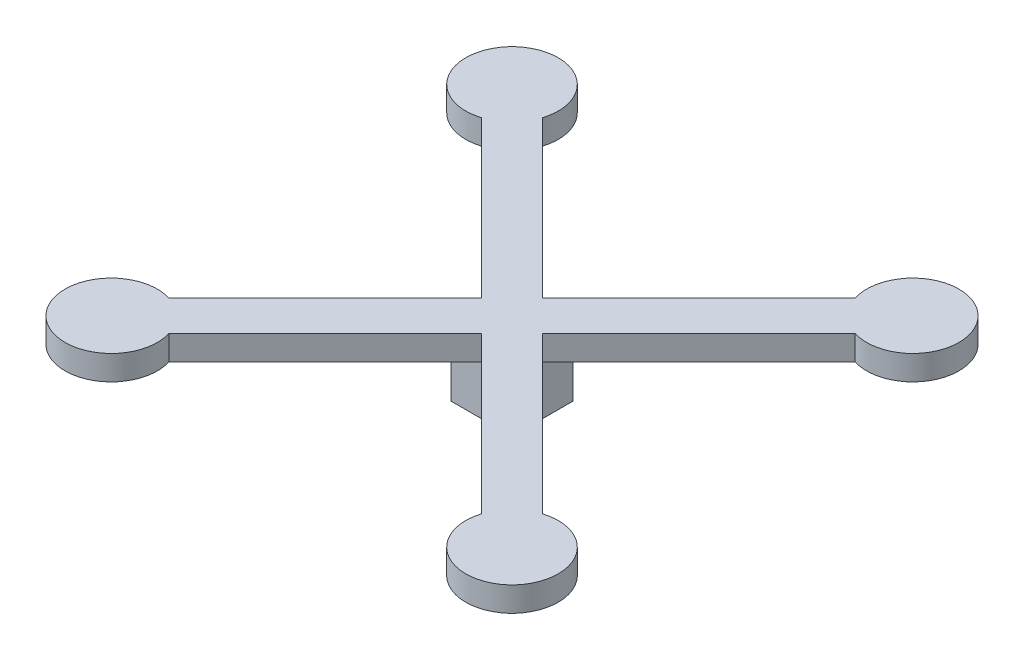
ISO-10303-21;
HEADER;
FILE_DESCRIPTION(('STEP AP214'),'2;1');
FILE_NAME('part.step','',(''),(''),'','','');
FILE_SCHEMA(('AUTOMOTIVE_DESIGN { 1 0 10303 214 1 1 1 1 }'));
ENDSEC;
DATA;
#1=APPLICATION_CONTEXT('core data for automotive mechanical design processes');
#2=APPLICATION_PROTOCOL_DEFINITION('international standard','automotive_design',2000,#1);
#3=PRODUCT_CONTEXT('',#1,'mechanical');
#4=PRODUCT('Part','Part','',(#3));
#5=PRODUCT_RELATED_PRODUCT_CATEGORY('part','',(#4));
#6=PRODUCT_DEFINITION_FORMATION('','',#4);
#7=PRODUCT_DEFINITION_CONTEXT('part definition',#1,'design');
#8=PRODUCT_DEFINITION('design','',#6,#7);
#9=PRODUCT_DEFINITION_SHAPE('','',#8);
#10=(LENGTH_UNIT() NAMED_UNIT(*) SI_UNIT(.MILLI.,.METRE.));
#11=(NAMED_UNIT(*) PLANE_ANGLE_UNIT() SI_UNIT($,.RADIAN.));
#12=(NAMED_UNIT(*) SI_UNIT($,.STERADIAN.) SOLID_ANGLE_UNIT());
#13=UNCERTAINTY_MEASURE_WITH_UNIT(LENGTH_MEASURE(1.E-05),#10,'distance_accuracy_value','');
#14=(GEOMETRIC_REPRESENTATION_CONTEXT(3) GLOBAL_UNCERTAINTY_ASSIGNED_CONTEXT((#13)) GLOBAL_UNIT_ASSIGNED_CONTEXT((#10,
#11,#12)) REPRESENTATION_CONTEXT('',''));
#15=CARTESIAN_POINT('',(0.,0.,0.));
#16=DIRECTION('',(0.,0.,1.));
#17=DIRECTION('',(1.,0.,0.));
#18=AXIS2_PLACEMENT_3D('',#15,#16,#17);
#19=CARTESIAN_POINT('',(0.,0.,0.));
#20=DIRECTION('',(0.,1.,0.));
#21=DIRECTION('',(0.,0.,1.));
#22=AXIS2_PLACEMENT_3D('',#19,#20,#21);
#23=PLANE('',#22);
#24=DIRECTION('',(1.,0.,0.));
#25=VECTOR('',#24,1.);
#26=CARTESIAN_POINT('',(-24.7487373415287,0.,-24.7487373415286));
#27=LINE('',#26,#25);
#28=CARTESIAN_POINT('',(-24.7487373415287,0.,-24.7487373415286));
#29=VERTEX_POINT('',#28);
#30=CARTESIAN_POINT('',(3.72098185597025E-13,0.,-24.7487373415296));
#31=VERTEX_POINT('',#30);
#32=EDGE_CURVE('E51',#29,#31,#27,.T.);
#33=ORIENTED_EDGE('',*,*,#32,.F.);
#34=DIRECTION('',(0.,0.,-1.));
#35=VECTOR('',#34,1.);
#36=CARTESIAN_POINT('',(-24.7487373415287,0.,24.7487373415286));
#37=LINE('',#36,#35);
#38=CARTESIAN_POINT('',(-24.7487373415287,0.,-3.55618312575245E-13));
#39=VERTEX_POINT('',#38);
#40=EDGE_CURVE('E49',#39,#29,#37,.T.);
#41=ORIENTED_EDGE('',*,*,#40,.F.);
#42=DIRECTION('',(0.707106781186552,0.,0.707106781186543));
#43=VECTOR('',#42,1.);
#44=CARTESIAN_POINT('',(-12.374368670764,0.,12.3743686707641));
#45=LINE('',#44,#43);
#46=CARTESIAN_POINT('',(-151.556849544553,0.,-126.808112203023));
#47=VERTEX_POINT('',#46);
#48=EDGE_CURVE('E223',#47,#39,#45,.T.);
#49=ORIENTED_EDGE('',*,*,#48,.F.);
#50=CARTESIAN_POINT('',(-162.634559672906,0.,-162.634559672905));
#51=DIRECTION('',(0.,1.,0.));
#52=DIRECTION('',(0.,0.,1.));
#53=AXIS2_PLACEMENT_3D('',#50,#51,#52);
#54=CIRCLE('',#53,37.5);
#55=CARTESIAN_POINT('',(-126.808112203024,0.,-151.556849544552));
#56=VERTEX_POINT('',#55);
#57=EDGE_CURVE('E221',#56,#47,#54,.T.);
#58=ORIENTED_EDGE('',*,*,#57,.F.);
#59=DIRECTION('',(-0.707106781186552,0.,-0.707106781186543));
#60=VECTOR('',#59,1.);
#61=CARTESIAN_POINT('',(12.374368670765,0.,-12.3743686707651));
#62=LINE('',#61,#60);
#63=EDGE_CURVE('E219',#31,#56,#62,.T.);
#64=ORIENTED_EDGE('',*,*,#63,.F.);
#65=EDGE_LOOP('',(#33,#41,#49,#58,#64));
#66=FACE_BOUND('',#65,.T.);
#67=ADVANCED_FACE('F40',(#66),#23,.F.);
#68=CARTESIAN_POINT('',(24.7487373415287,0.,-24.7487373415286));
#69=VERTEX_POINT('',#68);
#70=EDGE_CURVE('E11',#31,#69,#27,.T.);
#71=ORIENTED_EDGE('',*,*,#70,.F.);
#72=DIRECTION('',(-0.707106781186543,0.,0.707106781186552));
#73=VECTOR('',#72,1.);
#74=CARTESIAN_POINT('',(-12.3743686707646,0.,-12.3743686707645));
#75=LINE('',#74,#73);
#76=CARTESIAN_POINT('',(126.808112203023,0.,-151.556849544554));
#77=VERTEX_POINT('',#76);
#78=EDGE_CURVE('E184',#77,#31,#75,.T.);
#79=ORIENTED_EDGE('',*,*,#78,.F.);
#80=CARTESIAN_POINT('',(162.634559672905,0.,-162.634559672907));
#81=DIRECTION('',(0.,1.,0.));
#82=DIRECTION('',(0.,0.,1.));
#83=AXIS2_PLACEMENT_3D('',#80,#81,#82);
#84=CIRCLE('',#83,37.5);
#85=CARTESIAN_POINT('',(151.556849544552,0.,-126.808112203025));
#86=VERTEX_POINT('',#85);
#87=EDGE_CURVE('E181',#86,#77,#84,.T.);
#88=ORIENTED_EDGE('',*,*,#87,.F.);
#89=DIRECTION('',(0.707106781186544,0.,-0.707106781186551));
#90=VECTOR('',#89,1.);
#91=CARTESIAN_POINT('',(12.3743686707646,0.,12.3743686707645));
#92=LINE('',#91,#90);
#93=CARTESIAN_POINT('',(24.7487373415296,0.,-6.21898366137685E-13));
#94=VERTEX_POINT('',#93);
#95=EDGE_CURVE('E194',#94,#86,#92,.T.);
#96=ORIENTED_EDGE('',*,*,#95,.F.);
#97=DIRECTION('',(0.,0.,1.));
#98=VECTOR('',#97,1.);
#99=CARTESIAN_POINT('',(24.7487373415287,0.,24.7487373415286));
#100=LINE('',#99,#98);
#101=EDGE_CURVE('E65',#69,#94,#100,.T.);
#102=ORIENTED_EDGE('',*,*,#101,.F.);
#103=EDGE_LOOP('',(#71,#79,#88,#96,#102));
#104=FACE_BOUND('',#103,.T.);
#105=ADVANCED_FACE('F294',(#104),#23,.F.);
#106=CARTESIAN_POINT('',(24.7487373415287,0.,24.7487373415286));
#107=VERTEX_POINT('',#106);
#108=EDGE_CURVE('E180',#94,#107,#100,.T.);
#109=ORIENTED_EDGE('',*,*,#108,.F.);
#110=DIRECTION('',(-0.707106781186552,0.,-0.707106781186543));
#111=VECTOR('',#110,1.);
#112=CARTESIAN_POINT('',(12.374368670765,0.,-12.3743686707651));
#113=LINE('',#112,#111);
#114=CARTESIAN_POINT('',(151.556849544554,0.,126.808112203022));
#115=VERTEX_POINT('',#114);
#116=EDGE_CURVE('E237',#115,#94,#113,.T.);
#117=ORIENTED_EDGE('',*,*,#116,.F.);
#118=CARTESIAN_POINT('',(162.634559672907,0.,162.634559672904));
#119=DIRECTION('',(0.,1.,0.));
#120=DIRECTION('',(0.,0.,1.));
#121=AXIS2_PLACEMENT_3D('',#118,#119,#120);
#122=CIRCLE('',#121,37.5);
#123=CARTESIAN_POINT('',(126.808112203025,0.,151.556849544551));
#124=VERTEX_POINT('',#123);
#125=EDGE_CURVE('E235',#124,#115,#122,.T.);
#126=ORIENTED_EDGE('',*,*,#125,.F.);
#127=DIRECTION('',(0.707106781186552,0.,0.707106781186543));
#128=VECTOR('',#127,1.);
#129=CARTESIAN_POINT('',(-12.374368670764,0.,12.3743686707642));
#130=LINE('',#129,#128);
#131=CARTESIAN_POINT('',(6.13224748757801E-13,0.,24.7487373415286));
#132=VERTEX_POINT('',#131);
#133=EDGE_CURVE('E233',#132,#124,#130,.T.);
#134=ORIENTED_EDGE('',*,*,#133,.F.);
#135=DIRECTION('',(-1.,0.,0.));
#136=VECTOR('',#135,1.);
#137=CARTESIAN_POINT('',(-24.7487373415287,0.,24.7487373415286));
#138=LINE('',#137,#136);
#139=EDGE_CURVE('E279',#107,#132,#138,.T.);
#140=ORIENTED_EDGE('',*,*,#139,.F.);
#141=EDGE_LOOP('',(#109,#117,#126,#134,#140));
#142=FACE_BOUND('',#141,.T.);
#143=ADVANCED_FACE('F317',(#142),#23,.F.);
#144=CARTESIAN_POINT('',(-24.7487373415287,0.,24.7487373415286));
#145=VERTEX_POINT('',#144);
#146=EDGE_CURVE('E282',#145,#39,#37,.T.);
#147=ORIENTED_EDGE('',*,*,#146,.F.);
#148=EDGE_CURVE('E275',#132,#145,#138,.T.);
#149=ORIENTED_EDGE('',*,*,#148,.F.);
#150=DIRECTION('',(0.707106781186543,0.,-0.707106781186552));
#151=VECTOR('',#150,1.);
#152=CARTESIAN_POINT('',(12.3743686707646,0.,12.3743686707645));
#153=LINE('',#152,#151);
#154=CARTESIAN_POINT('',(-126.808112203022,0.,151.556849544553));
#155=VERTEX_POINT('',#154);
#156=EDGE_CURVE('E230',#155,#132,#153,.T.);
#157=ORIENTED_EDGE('',*,*,#156,.F.);
#158=CARTESIAN_POINT('',(-162.634559672904,0.,162.634559672906));
#159=DIRECTION('',(0.,1.,0.));
#160=DIRECTION('',(0.,0.,1.));
#161=AXIS2_PLACEMENT_3D('',#158,#159,#160);
#162=CIRCLE('',#161,37.5);
#163=CARTESIAN_POINT('',(-151.556849544551,0.,126.808112203024));
#164=VERTEX_POINT('',#163);
#165=EDGE_CURVE('E228',#164,#155,#162,.T.);
#166=ORIENTED_EDGE('',*,*,#165,.F.);
#167=DIRECTION('',(-0.707106781186543,0.,0.707106781186552));
#168=VECTOR('',#167,1.);
#169=CARTESIAN_POINT('',(-12.3743686707647,0.,-12.3743686707645));
#170=LINE('',#169,#168);
#171=EDGE_CURVE('E226',#39,#164,#170,.T.);
#172=ORIENTED_EDGE('',*,*,#171,.F.);
#173=EDGE_LOOP('',(#147,#149,#157,#166,#172));
#174=FACE_BOUND('',#173,.T.);
#175=ADVANCED_FACE('F335',(#174),#23,.F.);
#176=CARTESIAN_POINT('',(162.634559672905,20.,-162.634559672907));
#177=DIRECTION('',(0.,-1.,0.));
#178=DIRECTION('',(0.,0.,-1.));
#179=AXIS2_PLACEMENT_3D('',#176,#177,#178);
#180=CYLINDRICAL_SURFACE('',#179,37.5);
#181=ORIENTED_EDGE('',*,*,#87,.T.);
#182=DIRECTION('',(0.,-1.,0.));
#183=VECTOR('',#182,1.);
#184=CARTESIAN_POINT('',(126.808112203023,20.,-151.556849544554));
#185=LINE('',#184,#183);
#186=CARTESIAN_POINT('',(126.808112203023,20.,-151.556849544554));
#187=VERTEX_POINT('',#186);
#188=EDGE_CURVE('E44',#187,#77,#185,.T.);
#189=ORIENTED_EDGE('',*,*,#188,.F.);
#190=CARTESIAN_POINT('',(162.634559672905,20.,-162.634559672907));
#191=DIRECTION('',(0.,1.,0.));
#192=DIRECTION('',(0.,0.,1.));
#193=AXIS2_PLACEMENT_3D('',#190,#191,#192);
#194=CIRCLE('',#193,37.5);
#195=CARTESIAN_POINT('',(151.556849544552,20.,-126.808112203025));
#196=VERTEX_POINT('',#195);
#197=EDGE_CURVE('E190',#196,#187,#194,.T.);
#198=ORIENTED_EDGE('',*,*,#197,.F.);
#199=DIRECTION('',(0.,-1.,0.));
#200=VECTOR('',#199,1.);
#201=CARTESIAN_POINT('',(151.556849544552,20.,-126.808112203025));
#202=LINE('',#201,#200);
#203=EDGE_CURVE('E215',#196,#86,#202,.T.);
#204=ORIENTED_EDGE('',*,*,#203,.T.);
#205=EDGE_LOOP('',(#181,#189,#198,#204));
#206=FACE_BOUND('',#205,.T.);
#207=ADVANCED_FACE('F42',(#206),#180,.T.);
#208=CARTESIAN_POINT('',(-12.3743686707646,20.,-12.3743686707645));
#209=DIRECTION('',(0.707106781186552,0.,0.707106781186543));
#210=DIRECTION('',(0.707106781186543,0.,-0.707106781186552));
#211=AXIS2_PLACEMENT_3D('',#208,#209,#210);
#212=PLANE('',#211);
#213=ORIENTED_EDGE('',*,*,#78,.T.);
#214=DIRECTION('',(0.,-1.,0.));
#215=VECTOR('',#214,1.);
#216=CARTESIAN_POINT('',(3.72098185597025E-13,20.,-24.7487373415296));
#217=LINE('',#216,#215);
#218=CARTESIAN_POINT('',(3.72098185597025E-13,20.,-24.7487373415296));
#219=VERTEX_POINT('',#218);
#220=EDGE_CURVE('E269',#219,#31,#217,.T.);
#221=ORIENTED_EDGE('',*,*,#220,.F.);
#222=DIRECTION('',(-0.707106781186543,0.,0.707106781186552));
#223=VECTOR('',#222,1.);
#224=CARTESIAN_POINT('',(-12.3743686707646,20.,-12.3743686707645));
#225=LINE('',#224,#223);
#226=EDGE_CURVE('E193',#187,#219,#225,.T.);
#227=ORIENTED_EDGE('',*,*,#226,.F.);
#228=ORIENTED_EDGE('',*,*,#188,.T.);
#229=EDGE_LOOP('',(#213,#221,#227,#228));
#230=FACE_BOUND('',#229,.T.);
#231=ADVANCED_FACE('F296',(#230),#212,.F.);
#232=CARTESIAN_POINT('',(12.374368670765,20.,-12.3743686707651));
#233=DIRECTION('',(-0.707106781186543,0.,0.707106781186552));
#234=DIRECTION('',(0.707106781186552,0.,0.707106781186543));
#235=AXIS2_PLACEMENT_3D('',#232,#233,#234);
#236=PLANE('',#235);
#237=ORIENTED_EDGE('',*,*,#63,.T.);
#238=DIRECTION('',(0.,-1.,0.));
#239=VECTOR('',#238,1.);
#240=CARTESIAN_POINT('',(-126.808112203024,20.,-151.556849544552));
#241=LINE('',#240,#239);
#242=CARTESIAN_POINT('',(-126.808112203024,20.,-151.556849544552));
#243=VERTEX_POINT('',#242);
#244=EDGE_CURVE('E267',#243,#56,#241,.T.);
#245=ORIENTED_EDGE('',*,*,#244,.F.);
#246=DIRECTION('',(-0.707106781186552,0.,-0.707106781186543));
#247=VECTOR('',#246,1.);
#248=CARTESIAN_POINT('',(12.374368670765,20.,-12.3743686707651));
#249=LINE('',#248,#247);
#250=EDGE_CURVE('E196',#219,#243,#249,.T.);
#251=ORIENTED_EDGE('',*,*,#250,.F.);
#252=ORIENTED_EDGE('',*,*,#220,.T.);
#253=EDGE_LOOP('',(#237,#245,#251,#252));
#254=FACE_BOUND('',#253,.T.);
#255=ADVANCED_FACE('F298',(#254),#236,.F.);
#256=CARTESIAN_POINT('',(-162.634559672906,20.,-162.634559672905));
#257=DIRECTION('',(0.,-1.,0.));
#258=DIRECTION('',(0.,0.,-1.));
#259=AXIS2_PLACEMENT_3D('',#256,#257,#258);
#260=CYLINDRICAL_SURFACE('',#259,37.5);
#261=ORIENTED_EDGE('',*,*,#57,.T.);
#262=DIRECTION('',(0.,-1.,0.));
#263=VECTOR('',#262,1.);
#264=CARTESIAN_POINT('',(-151.556849544553,20.,-126.808112203023));
#265=LINE('',#264,#263);
#266=CARTESIAN_POINT('',(-151.556849544553,20.,-126.808112203023));
#267=VERTEX_POINT('',#266);
#268=EDGE_CURVE('E264',#267,#47,#265,.T.);
#269=ORIENTED_EDGE('',*,*,#268,.F.);
#270=CARTESIAN_POINT('',(-162.634559672906,20.,-162.634559672905));
#271=DIRECTION('',(0.,1.,0.));
#272=DIRECTION('',(0.,0.,1.));
#273=AXIS2_PLACEMENT_3D('',#270,#271,#272);
#274=CIRCLE('',#273,37.5);
#275=EDGE_CURVE('E198',#243,#267,#274,.T.);
#276=ORIENTED_EDGE('',*,*,#275,.F.);
#277=ORIENTED_EDGE('',*,*,#244,.T.);
#278=EDGE_LOOP('',(#261,#269,#276,#277));
#279=FACE_BOUND('',#278,.T.);
#280=ADVANCED_FACE('F413',(#279),#260,.T.);
#281=CARTESIAN_POINT('',(-12.374368670764,20.,12.3743686707641));
#282=DIRECTION('',(0.707106781186543,0.,-0.707106781186552));
#283=DIRECTION('',(-0.707106781186552,0.,-0.707106781186543));
#284=AXIS2_PLACEMENT_3D('',#281,#282,#283);
#285=PLANE('',#284);
#286=ORIENTED_EDGE('',*,*,#48,.T.);
#287=DIRECTION('',(0.,-1.,0.));
#288=VECTOR('',#287,1.);
#289=CARTESIAN_POINT('',(-24.7487373415287,20.,-3.55618312575245E-13));
#290=LINE('',#289,#288);
#291=CARTESIAN_POINT('',(-24.7487373415287,20.,-3.55618312575245E-13));
#292=VERTEX_POINT('',#291);
#293=EDGE_CURVE('E261',#292,#39,#290,.T.);
#294=ORIENTED_EDGE('',*,*,#293,.F.);
#295=DIRECTION('',(0.707106781186552,0.,0.707106781186543));
#296=VECTOR('',#295,1.);
#297=CARTESIAN_POINT('',(-12.374368670764,20.,12.3743686707641));
#298=LINE('',#297,#296);
#299=EDGE_CURVE('E200',#267,#292,#298,.T.);
#300=ORIENTED_EDGE('',*,*,#299,.F.);
#301=ORIENTED_EDGE('',*,*,#268,.T.);
#302=EDGE_LOOP('',(#286,#294,#300,#301));
#303=FACE_BOUND('',#302,.T.);
#304=ADVANCED_FACE('F351',(#303),#285,.F.);
#305=CARTESIAN_POINT('',(-12.3743686707647,20.,-12.3743686707645));
#306=DIRECTION('',(0.707106781186552,0.,0.707106781186543));
#307=DIRECTION('',(0.707106781186543,0.,-0.707106781186552));
#308=AXIS2_PLACEMENT_3D('',#305,#306,#307);
#309=PLANE('',#308);
#310=ORIENTED_EDGE('',*,*,#171,.T.);
#311=DIRECTION('',(0.,-1.,0.));
#312=VECTOR('',#311,1.);
#313=CARTESIAN_POINT('',(-151.556849544551,20.,126.808112203024));
#314=LINE('',#313,#312);
#315=CARTESIAN_POINT('',(-151.556849544551,20.,126.808112203024));
#316=VERTEX_POINT('',#315);
#317=EDGE_CURVE('E258',#316,#164,#314,.T.);
#318=ORIENTED_EDGE('',*,*,#317,.F.);
#319=DIRECTION('',(-0.707106781186543,0.,0.707106781186552));
#320=VECTOR('',#319,1.);
#321=CARTESIAN_POINT('',(-12.3743686707647,20.,-12.3743686707645));
#322=LINE('',#321,#320);
#323=EDGE_CURVE('E202',#292,#316,#322,.T.);
#324=ORIENTED_EDGE('',*,*,#323,.F.);
#325=ORIENTED_EDGE('',*,*,#293,.T.);
#326=EDGE_LOOP('',(#310,#318,#324,#325));
#327=FACE_BOUND('',#326,.T.);
#328=ADVANCED_FACE('F339',(#327),#309,.F.);
#329=CARTESIAN_POINT('',(-162.634559672904,20.,162.634559672906));
#330=DIRECTION('',(0.,-1.,0.));
#331=DIRECTION('',(0.,0.,-1.));
#332=AXIS2_PLACEMENT_3D('',#329,#330,#331);
#333=CYLINDRICAL_SURFACE('',#332,37.5);
#334=ORIENTED_EDGE('',*,*,#165,.T.);
#335=DIRECTION('',(0.,-1.,0.));
#336=VECTOR('',#335,1.);
#337=CARTESIAN_POINT('',(-126.808112203022,20.,151.556849544553));
#338=LINE('',#337,#336);
#339=CARTESIAN_POINT('',(-126.808112203022,20.,151.556849544553));
#340=VERTEX_POINT('',#339);
#341=EDGE_CURVE('E255',#340,#155,#338,.T.);
#342=ORIENTED_EDGE('',*,*,#341,.F.);
#343=CARTESIAN_POINT('',(-162.634559672904,20.,162.634559672906));
#344=DIRECTION('',(0.,1.,0.));
#345=DIRECTION('',(0.,0.,1.));
#346=AXIS2_PLACEMENT_3D('',#343,#344,#345);
#347=CIRCLE('',#346,37.5);
#348=EDGE_CURVE('E204',#316,#340,#347,.T.);
#349=ORIENTED_EDGE('',*,*,#348,.F.);
#350=ORIENTED_EDGE('',*,*,#317,.T.);
#351=EDGE_LOOP('',(#334,#342,#349,#350));
#352=FACE_BOUND('',#351,.T.);
#353=ADVANCED_FACE('F343',(#352),#333,.T.);
#354=CARTESIAN_POINT('',(12.3743686707646,20.,12.3743686707645));
#355=DIRECTION('',(-0.707106781186552,0.,-0.707106781186543));
#356=DIRECTION('',(-0.707106781186543,0.,0.707106781186552));
#357=AXIS2_PLACEMENT_3D('',#354,#355,#356);
#358=PLANE('',#357);
#359=ORIENTED_EDGE('',*,*,#156,.T.);
#360=DIRECTION('',(0.,-1.,0.));
#361=VECTOR('',#360,1.);
#362=CARTESIAN_POINT('',(6.13224748757801E-13,20.,24.7487373415286));
#363=LINE('',#362,#361);
#364=CARTESIAN_POINT('',(6.13224748757801E-13,20.,24.7487373415286));
#365=VERTEX_POINT('',#364);
#366=EDGE_CURVE('E252',#365,#132,#363,.T.);
#367=ORIENTED_EDGE('',*,*,#366,.F.);
#368=DIRECTION('',(0.707106781186543,0.,-0.707106781186552));
#369=VECTOR('',#368,1.);
#370=CARTESIAN_POINT('',(12.3743686707646,20.,12.3743686707645));
#371=LINE('',#370,#369);
#372=EDGE_CURVE('E206',#340,#365,#371,.T.);
#373=ORIENTED_EDGE('',*,*,#372,.F.);
#374=ORIENTED_EDGE('',*,*,#341,.T.);
#375=EDGE_LOOP('',(#359,#367,#373,#374));
#376=FACE_BOUND('',#375,.T.);
#377=ADVANCED_FACE('F331',(#376),#358,.F.);
#378=CARTESIAN_POINT('',(-12.374368670764,20.,12.3743686707642));
#379=DIRECTION('',(0.707106781186543,0.,-0.707106781186552));
#380=DIRECTION('',(-0.707106781186552,0.,-0.707106781186543));
#381=AXIS2_PLACEMENT_3D('',#378,#379,#380);
#382=PLANE('',#381);
#383=ORIENTED_EDGE('',*,*,#133,.T.);
#384=DIRECTION('',(0.,-1.,0.));
#385=VECTOR('',#384,1.);
#386=CARTESIAN_POINT('',(126.808112203025,20.,151.556849544551));
#387=LINE('',#386,#385);
#388=CARTESIAN_POINT('',(126.808112203025,20.,151.556849544551));
#389=VERTEX_POINT('',#388);
#390=EDGE_CURVE('E249',#389,#124,#387,.T.);
#391=ORIENTED_EDGE('',*,*,#390,.F.);
#392=DIRECTION('',(0.707106781186552,0.,0.707106781186543));
#393=VECTOR('',#392,1.);
#394=CARTESIAN_POINT('',(-12.374368670764,20.,12.3743686707642));
#395=LINE('',#394,#393);
#396=EDGE_CURVE('E208',#365,#389,#395,.T.);
#397=ORIENTED_EDGE('',*,*,#396,.F.);
#398=ORIENTED_EDGE('',*,*,#366,.T.);
#399=EDGE_LOOP('',(#383,#391,#397,#398));
#400=FACE_BOUND('',#399,.T.);
#401=ADVANCED_FACE('F321',(#400),#382,.F.);
#402=CARTESIAN_POINT('',(162.634559672907,20.,162.634559672904));
#403=DIRECTION('',(0.,-1.,0.));
#404=DIRECTION('',(0.,0.,-1.));
#405=AXIS2_PLACEMENT_3D('',#402,#403,#404);
#406=CYLINDRICAL_SURFACE('',#405,37.5);
#407=ORIENTED_EDGE('',*,*,#125,.T.);
#408=DIRECTION('',(0.,-1.,0.));
#409=VECTOR('',#408,1.);
#410=CARTESIAN_POINT('',(151.556849544554,20.,126.808112203022));
#411=LINE('',#410,#409);
#412=CARTESIAN_POINT('',(151.556849544554,20.,126.808112203022));
#413=VERTEX_POINT('',#412);
#414=EDGE_CURVE('E246',#413,#115,#411,.T.);
#415=ORIENTED_EDGE('',*,*,#414,.F.);
#416=CARTESIAN_POINT('',(162.634559672907,20.,162.634559672904));
#417=DIRECTION('',(0.,1.,0.));
#418=DIRECTION('',(0.,0.,1.));
#419=AXIS2_PLACEMENT_3D('',#416,#417,#418);
#420=CIRCLE('',#419,37.5);
#421=EDGE_CURVE('E210',#389,#413,#420,.T.);
#422=ORIENTED_EDGE('',*,*,#421,.F.);
#423=ORIENTED_EDGE('',*,*,#390,.T.);
#424=EDGE_LOOP('',(#407,#415,#422,#423));
#425=FACE_BOUND('',#424,.T.);
#426=ADVANCED_FACE('F326',(#425),#406,.T.);
#427=CARTESIAN_POINT('',(12.374368670765,20.,-12.3743686707651));
#428=DIRECTION('',(-0.707106781186543,0.,0.707106781186552));
#429=DIRECTION('',(0.707106781186552,0.,0.707106781186543));
#430=AXIS2_PLACEMENT_3D('',#427,#428,#429);
#431=PLANE('',#430);
#432=ORIENTED_EDGE('',*,*,#116,.T.);
#433=DIRECTION('',(0.,-1.,0.));
#434=VECTOR('',#433,1.);
#435=CARTESIAN_POINT('',(24.7487373415296,20.,-6.21898366137685E-13));
#436=LINE('',#435,#434);
#437=CARTESIAN_POINT('',(24.7487373415296,20.,-6.21898366137685E-13));
#438=VERTEX_POINT('',#437);
#439=EDGE_CURVE('E243',#438,#94,#436,.T.);
#440=ORIENTED_EDGE('',*,*,#439,.F.);
#441=DIRECTION('',(-0.707106781186552,0.,-0.707106781186543));
#442=VECTOR('',#441,1.);
#443=CARTESIAN_POINT('',(12.374368670765,20.,-12.3743686707651));
#444=LINE('',#443,#442);
#445=EDGE_CURVE('E212',#413,#438,#444,.T.);
#446=ORIENTED_EDGE('',*,*,#445,.F.);
#447=ORIENTED_EDGE('',*,*,#414,.T.);
#448=EDGE_LOOP('',(#432,#440,#446,#447));
#449=FACE_BOUND('',#448,.T.);
#450=ADVANCED_FACE('F312',(#449),#431,.F.);
#451=CARTESIAN_POINT('',(12.3743686707646,20.,12.3743686707645));
#452=DIRECTION('',(-0.707106781186551,0.,-0.707106781186544));
#453=DIRECTION('',(-0.707106781186544,0.,0.707106781186551));
#454=AXIS2_PLACEMENT_3D('',#451,#452,#453);
#455=PLANE('',#454);
#456=ORIENTED_EDGE('',*,*,#95,.T.);
#457=ORIENTED_EDGE('',*,*,#203,.F.);
#458=DIRECTION('',(0.707106781186544,0.,-0.707106781186551));
#459=VECTOR('',#458,1.);
#460=CARTESIAN_POINT('',(12.3743686707646,20.,12.3743686707645));
#461=LINE('',#460,#459);
#462=EDGE_CURVE('E214',#438,#196,#461,.T.);
#463=ORIENTED_EDGE('',*,*,#462,.F.);
#464=ORIENTED_EDGE('',*,*,#439,.T.);
#465=EDGE_LOOP('',(#456,#457,#463,#464));
#466=FACE_BOUND('',#465,.T.);
#467=ADVANCED_FACE('F308',(#466),#455,.F.);
#468=CARTESIAN_POINT('',(0.,20.,0.));
#469=DIRECTION('',(0.,1.,0.));
#470=DIRECTION('',(0.,0.,1.));
#471=AXIS2_PLACEMENT_3D('',#468,#469,#470);
#472=PLANE('',#471);
#473=ORIENTED_EDGE('',*,*,#197,.T.);
#474=ORIENTED_EDGE('',*,*,#226,.T.);
#475=ORIENTED_EDGE('',*,*,#250,.T.);
#476=ORIENTED_EDGE('',*,*,#275,.T.);
#477=ORIENTED_EDGE('',*,*,#299,.T.);
#478=ORIENTED_EDGE('',*,*,#323,.T.);
#479=ORIENTED_EDGE('',*,*,#348,.T.);
#480=ORIENTED_EDGE('',*,*,#372,.T.);
#481=ORIENTED_EDGE('',*,*,#396,.T.);
#482=ORIENTED_EDGE('',*,*,#421,.T.);
#483=ORIENTED_EDGE('',*,*,#445,.T.);
#484=ORIENTED_EDGE('',*,*,#462,.T.);
#485=EDGE_LOOP('',(#473,#474,#475,#476,#477,#478,#479,#480,#481,#482,#483,#484));
#486=FACE_BOUND('',#485,.T.);
#487=ADVANCED_FACE('F301',(#486),#472,.T.);
#488=CARTESIAN_POINT('',(24.7487373415287,-40.,24.7487373415286));
#489=DIRECTION('',(-1.,0.,0.));
#490=DIRECTION('',(0.,0.,1.));
#491=AXIS2_PLACEMENT_3D('',#488,#489,#490);
#492=PLANE('',#491);
#493=ORIENTED_EDGE('',*,*,#101,.T.);
#494=ORIENTED_EDGE('',*,*,#108,.T.);
#495=DIRECTION('',(0.,1.,0.));
#496=VECTOR('',#495,1.);
#497=CARTESIAN_POINT('',(24.7487373415287,-40.,24.7487373415286));
#498=LINE('',#497,#496);
#499=CARTESIAN_POINT('',(24.7487373415287,-40.,24.7487373415286));
#500=VERTEX_POINT('',#499);
#501=EDGE_CURVE('E161',#500,#107,#498,.T.);
#502=ORIENTED_EDGE('',*,*,#501,.F.);
#503=DIRECTION('',(0.,0.,1.));
#504=VECTOR('',#503,1.);
#505=CARTESIAN_POINT('',(24.7487373415287,-40.,24.7487373415286));
#506=LINE('',#505,#504);
#507=CARTESIAN_POINT('',(24.7487373415287,-40.,-24.7487373415286));
#508=VERTEX_POINT('',#507);
#509=EDGE_CURVE('E168',#508,#500,#506,.T.);
#510=ORIENTED_EDGE('',*,*,#509,.F.);
#511=DIRECTION('',(0.,1.,0.));
#512=VECTOR('',#511,1.);
#513=CARTESIAN_POINT('',(24.7487373415287,-40.,-24.7487373415286));
#514=LINE('',#513,#512);
#515=EDGE_CURVE('E286',#508,#69,#514,.T.);
#516=ORIENTED_EDGE('',*,*,#515,.T.);
#517=EDGE_LOOP('',(#493,#494,#502,#510,#516));
#518=FACE_BOUND('',#517,.T.);
#519=ADVANCED_FACE('F179',(#518),#492,.F.);
#520=CARTESIAN_POINT('',(-24.7487373415287,-40.,24.7487373415286));
#521=DIRECTION('',(0.,0.,-1.));
#522=DIRECTION('',(-1.,0.,0.));
#523=AXIS2_PLACEMENT_3D('',#520,#521,#522);
#524=PLANE('',#523);
#525=ORIENTED_EDGE('',*,*,#139,.T.);
#526=ORIENTED_EDGE('',*,*,#148,.T.);
#527=DIRECTION('',(0.,1.,0.));
#528=VECTOR('',#527,1.);
#529=CARTESIAN_POINT('',(-24.7487373415287,-40.,24.7487373415286));
#530=LINE('',#529,#528);
#531=CARTESIAN_POINT('',(-24.7487373415287,-40.,24.7487373415286));
#532=VERTEX_POINT('',#531);
#533=EDGE_CURVE('E164',#532,#145,#530,.T.);
#534=ORIENTED_EDGE('',*,*,#533,.F.);
#535=DIRECTION('',(-1.,0.,0.));
#536=VECTOR('',#535,1.);
#537=CARTESIAN_POINT('',(-24.7487373415287,-40.,24.7487373415286));
#538=LINE('',#537,#536);
#539=EDGE_CURVE('E156',#500,#532,#538,.T.);
#540=ORIENTED_EDGE('',*,*,#539,.F.);
#541=ORIENTED_EDGE('',*,*,#501,.T.);
#542=EDGE_LOOP('',(#525,#526,#534,#540,#541));
#543=FACE_BOUND('',#542,.T.);
#544=ADVANCED_FACE('F159',(#543),#524,.F.);
#545=CARTESIAN_POINT('',(-24.7487373415287,-40.,24.7487373415286));
#546=DIRECTION('',(1.,0.,0.));
#547=DIRECTION('',(0.,0.,-1.));
#548=AXIS2_PLACEMENT_3D('',#545,#546,#547);
#549=PLANE('',#548);
#550=ORIENTED_EDGE('',*,*,#146,.T.);
#551=ORIENTED_EDGE('',*,*,#40,.T.);
#552=DIRECTION('',(0.,1.,0.));
#553=VECTOR('',#552,1.);
#554=CARTESIAN_POINT('',(-24.7487373415287,-40.,-24.7487373415286));
#555=LINE('',#554,#553);
#556=CARTESIAN_POINT('',(-24.7487373415287,-40.,-24.7487373415286));
#557=VERTEX_POINT('',#556);
#558=EDGE_CURVE('E186',#557,#29,#555,.T.);
#559=ORIENTED_EDGE('',*,*,#558,.F.);
#560=DIRECTION('',(0.,0.,-1.));
#561=VECTOR('',#560,1.);
#562=CARTESIAN_POINT('',(-24.7487373415287,-40.,24.7487373415286));
#563=LINE('',#562,#561);
#564=EDGE_CURVE('E167',#532,#557,#563,.T.);
#565=ORIENTED_EDGE('',*,*,#564,.F.);
#566=ORIENTED_EDGE('',*,*,#533,.T.);
#567=EDGE_LOOP('',(#550,#551,#559,#565,#566));
#568=FACE_BOUND('',#567,.T.);
#569=ADVANCED_FACE('F290',(#568),#549,.F.);
#570=CARTESIAN_POINT('',(-24.7487373415287,-40.,-24.7487373415286));
#571=DIRECTION('',(0.,0.,1.));
#572=DIRECTION('',(1.,0.,0.));
#573=AXIS2_PLACEMENT_3D('',#570,#571,#572);
#574=PLANE('',#573);
#575=ORIENTED_EDGE('',*,*,#32,.T.);
#576=ORIENTED_EDGE('',*,*,#70,.T.);
#577=ORIENTED_EDGE('',*,*,#515,.F.);
#578=DIRECTION('',(1.,0.,0.));
#579=VECTOR('',#578,1.);
#580=CARTESIAN_POINT('',(-24.7487373415287,-40.,-24.7487373415286));
#581=LINE('',#580,#579);
#582=EDGE_CURVE('E173',#557,#508,#581,.T.);
#583=ORIENTED_EDGE('',*,*,#582,.F.);
#584=ORIENTED_EDGE('',*,*,#558,.T.);
#585=EDGE_LOOP('',(#575,#576,#577,#583,#584));
#586=FACE_BOUND('',#585,.T.);
#587=ADVANCED_FACE('F292',(#586),#574,.F.);
#588=CARTESIAN_POINT('',(0.,-40.,0.));
#589=DIRECTION('',(0.,-1.,0.));
#590=DIRECTION('',(0.,0.,-1.));
#591=AXIS2_PLACEMENT_3D('',#588,#589,#590);
#592=PLANE('',#591);
#593=ORIENTED_EDGE('',*,*,#509,.T.);
#594=ORIENTED_EDGE('',*,*,#539,.T.);
#595=ORIENTED_EDGE('',*,*,#564,.T.);
#596=ORIENTED_EDGE('',*,*,#582,.T.);
#597=EDGE_LOOP('',(#593,#594,#595,#596));
#598=FACE_BOUND('',#597,.T.);
#599=ADVANCED_FACE('F171',(#598),#592,.T.);
#600=CLOSED_SHELL('',(#67,#105,#143,#175,#207,#231,#255,#280,#304,#328,#353,#377,#401,#426,#450,
#467,#487,#519,#544,#569,#587,#599));
#601=MANIFOLD_SOLID_BREP('B2',#600);
#602=ADVANCED_BREP_SHAPE_REPRESENTATION('',(#18,#601),#14);
#603=SHAPE_DEFINITION_REPRESENTATION(#9,#602);
ENDSEC;
END-ISO-10303-21;
